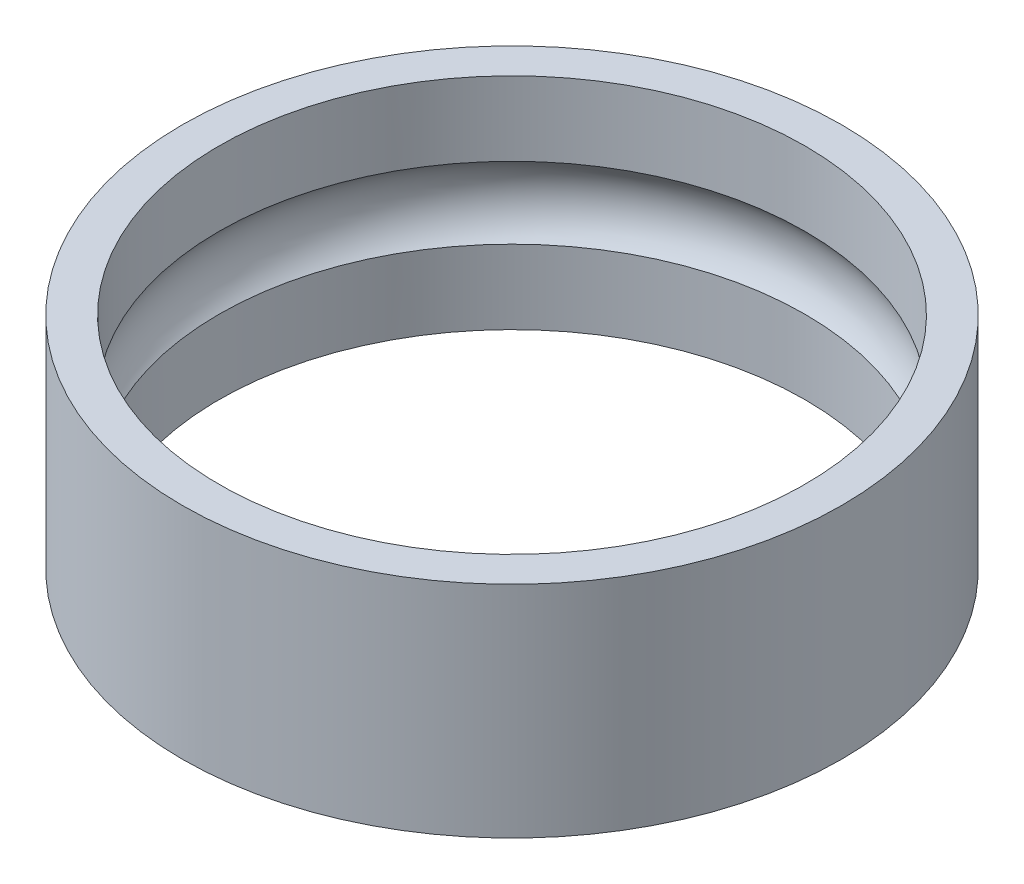
ISO-10303-21;
HEADER;
FILE_DESCRIPTION(('STEP AP214'),'2;1');
FILE_NAME('part.step','',(''),(''),'','','');
FILE_SCHEMA(('AUTOMOTIVE_DESIGN { 1 0 10303 214 1 1 1 1 }'));
ENDSEC;
DATA;
#1=APPLICATION_CONTEXT('core data for automotive mechanical design processes');
#2=APPLICATION_PROTOCOL_DEFINITION('international standard','automotive_design',2000,#1);
#3=PRODUCT_CONTEXT('',#1,'mechanical');
#4=PRODUCT('Part','Part','',(#3));
#5=PRODUCT_RELATED_PRODUCT_CATEGORY('part','',(#4));
#6=PRODUCT_DEFINITION_FORMATION('','',#4);
#7=PRODUCT_DEFINITION_CONTEXT('part definition',#1,'design');
#8=PRODUCT_DEFINITION('design','',#6,#7);
#9=PRODUCT_DEFINITION_SHAPE('','',#8);
#10=(LENGTH_UNIT() NAMED_UNIT(*) SI_UNIT(.MILLI.,.METRE.));
#11=(NAMED_UNIT(*) PLANE_ANGLE_UNIT() SI_UNIT($,.RADIAN.));
#12=(NAMED_UNIT(*) SI_UNIT($,.STERADIAN.) SOLID_ANGLE_UNIT());
#13=UNCERTAINTY_MEASURE_WITH_UNIT(LENGTH_MEASURE(1.E-05),#10,'distance_accuracy_value','');
#14=(GEOMETRIC_REPRESENTATION_CONTEXT(3) GLOBAL_UNCERTAINTY_ASSIGNED_CONTEXT((#13)) GLOBAL_UNIT_ASSIGNED_CONTEXT((#10,
#11,#12)) REPRESENTATION_CONTEXT('',''));
#15=CARTESIAN_POINT('',(0.,0.,0.));
#16=DIRECTION('',(0.,0.,1.));
#17=DIRECTION('',(1.,0.,0.));
#18=AXIS2_PLACEMENT_3D('',#15,#16,#17);
#19=CARTESIAN_POINT('',(0.,-1.5,0.));
#20=DIRECTION('',(0.,1.,0.));
#21=DIRECTION('',(1.,0.,0.));
#22=AXIS2_PLACEMENT_3D('',#19,#20,#21);
#23=PLANE('',#22);
#24=CARTESIAN_POINT('',(0.,-1.5,0.));
#25=DIRECTION('',(0.,1.,0.));
#26=DIRECTION('',(0.,0.,-1.));
#27=AXIS2_PLACEMENT_3D('',#24,#25,#26);
#28=CIRCLE('',#27,4.);
#29=CARTESIAN_POINT('',(0.,-1.5,-4.));
#30=VERTEX_POINT('',#29);
#31=EDGE_CURVE('E27',#30,#30,#28,.T.);
#32=ORIENTED_EDGE('',*,*,#31,.T.);
#33=EDGE_LOOP('',(#32));
#34=FACE_BOUND('',#33,.T.);
#35=CARTESIAN_POINT('',(0.,-1.5,0.));
#36=DIRECTION('',(0.,1.,0.));
#37=DIRECTION('',(0.,0.,1.));
#38=AXIS2_PLACEMENT_3D('',#35,#36,#37);
#39=CIRCLE('',#38,4.5);
#40=CARTESIAN_POINT('',(0.,-1.5,-4.5));
#41=VERTEX_POINT('',#40);
#42=EDGE_CURVE('E81',#41,#41,#39,.T.);
#43=ORIENTED_EDGE('',*,*,#42,.F.);
#44=EDGE_LOOP('',(#43));
#45=FACE_BOUND('',#44,.T.);
#46=ADVANCED_FACE('F16',(#34,#45),#23,.F.);
#47=CARTESIAN_POINT('',(0.,1.5,0.));
#48=DIRECTION('',(0.,1.,0.));
#49=DIRECTION('',(1.,0.,0.));
#50=AXIS2_PLACEMENT_3D('',#47,#48,#49);
#51=PLANE('',#50);
#52=CARTESIAN_POINT('',(0.,1.5,0.));
#53=DIRECTION('',(0.,1.,0.));
#54=DIRECTION('',(0.,0.,-1.));
#55=AXIS2_PLACEMENT_3D('',#52,#53,#54);
#56=CIRCLE('',#55,4.);
#57=CARTESIAN_POINT('',(0.,1.5,-4.));
#58=VERTEX_POINT('',#57);
#59=EDGE_CURVE('E11',#58,#58,#56,.T.);
#60=ORIENTED_EDGE('',*,*,#59,.F.);
#61=EDGE_LOOP('',(#60));
#62=FACE_BOUND('',#61,.T.);
#63=CARTESIAN_POINT('',(0.,1.5,0.));
#64=DIRECTION('',(0.,1.,0.));
#65=DIRECTION('',(0.,0.,1.));
#66=AXIS2_PLACEMENT_3D('',#63,#64,#65);
#67=CIRCLE('',#66,4.5);
#68=CARTESIAN_POINT('',(0.,1.5,-4.5));
#69=VERTEX_POINT('',#68);
#70=EDGE_CURVE('E20',#69,#69,#67,.T.);
#71=ORIENTED_EDGE('',*,*,#70,.T.);
#72=EDGE_LOOP('',(#71));
#73=FACE_BOUND('',#72,.T.);
#74=ADVANCED_FACE('F103',(#62,#73),#51,.T.);
#75=CARTESIAN_POINT('',(0.,1.5,0.));
#76=DIRECTION('',(0.,-1.,0.));
#77=DIRECTION('',(0.,0.,-1.));
#78=AXIS2_PLACEMENT_3D('',#75,#76,#77);
#79=CYLINDRICAL_SURFACE('',#78,4.);
#80=CARTESIAN_POINT('',(0.,0.489897948556635,0.));
#81=DIRECTION('',(0.,-1.,0.));
#82=DIRECTION('',(0.,0.,1.));
#83=AXIS2_PLACEMENT_3D('',#80,#81,#82);
#84=CIRCLE('',#83,4.);
#85=CARTESIAN_POINT('',(0.,0.489897948556634,4.));
#86=VERTEX_POINT('',#85);
#87=CARTESIAN_POINT('',(0.,0.489897948556635,-4.));
#88=VERTEX_POINT('',#87);
#89=EDGE_CURVE('E63',#86,#88,#84,.T.);
#90=ORIENTED_EDGE('',*,*,#89,.T.);
#91=CARTESIAN_POINT('',(0.,0.489897948556635,0.));
#92=DIRECTION('',(0.,-1.,0.));
#93=DIRECTION('',(0.,0.,-1.));
#94=AXIS2_PLACEMENT_3D('',#91,#92,#93);
#95=CIRCLE('',#94,4.);
#96=EDGE_CURVE('E65',#88,#86,#95,.T.);
#97=ORIENTED_EDGE('',*,*,#96,.T.);
#98=EDGE_LOOP('',(#90,#97));
#99=FACE_BOUND('',#98,.T.);
#100=ORIENTED_EDGE('',*,*,#59,.T.);
#101=EDGE_LOOP('',(#100));
#102=FACE_BOUND('',#101,.T.);
#103=ADVANCED_FACE('F18',(#99,#102),#79,.F.);
#104=CARTESIAN_POINT('',(0.,1.5,0.));
#105=DIRECTION('',(0.,-1.,0.));
#106=DIRECTION('',(0.,0.,-1.));
#107=AXIS2_PLACEMENT_3D('',#104,#105,#106);
#108=CYLINDRICAL_SURFACE('',#107,4.);
#109=CARTESIAN_POINT('',(0.,-0.489897948556635,0.));
#110=DIRECTION('',(0.,1.,0.));
#111=DIRECTION('',(0.,0.,1.));
#112=AXIS2_PLACEMENT_3D('',#109,#110,#111);
#113=CIRCLE('',#112,4.);
#114=CARTESIAN_POINT('',(0.,-0.489897948556635,4.));
#115=VERTEX_POINT('',#114);
#116=CARTESIAN_POINT('',(0.,-0.489897948556635,-4.));
#117=VERTEX_POINT('',#116);
#118=EDGE_CURVE('E79',#115,#117,#113,.T.);
#119=ORIENTED_EDGE('',*,*,#118,.T.);
#120=CARTESIAN_POINT('',(0.,-0.489897948556635,0.));
#121=DIRECTION('',(0.,1.,0.));
#122=DIRECTION('',(0.,0.,-1.));
#123=AXIS2_PLACEMENT_3D('',#120,#121,#122);
#124=CIRCLE('',#123,4.);
#125=EDGE_CURVE('E68',#117,#115,#124,.T.);
#126=ORIENTED_EDGE('',*,*,#125,.T.);
#127=EDGE_LOOP('',(#119,#126));
#128=FACE_BOUND('',#127,.T.);
#129=ORIENTED_EDGE('',*,*,#31,.F.);
#130=EDGE_LOOP('',(#129));
#131=FACE_BOUND('',#130,.T.);
#132=ADVANCED_FACE('F88',(#128,#131),#108,.F.);
#133=CARTESIAN_POINT('',(0.,1.5,0.));
#134=DIRECTION('',(0.,-1.,0.));
#135=DIRECTION('',(0.,0.,-1.));
#136=AXIS2_PLACEMENT_3D('',#133,#134,#135);
#137=CYLINDRICAL_SURFACE('',#136,4.5);
#138=ORIENTED_EDGE('',*,*,#70,.F.);
#139=EDGE_LOOP('',(#138));
#140=FACE_BOUND('',#139,.T.);
#141=ORIENTED_EDGE('',*,*,#42,.T.);
#142=EDGE_LOOP('',(#141));
#143=FACE_BOUND('',#142,.T.);
#144=ADVANCED_FACE('F92',(#140,#143),#137,.T.);
#145=CARTESIAN_POINT('',(0.,0.,0.));
#146=DIRECTION('',(0.,1.,0.));
#147=DIRECTION('',(0.,0.,1.));
#148=AXIS2_PLACEMENT_3D('',#145,#146,#147);
#149=TOROIDAL_SURFACE('',#148,3.5,0.7);
#150=ORIENTED_EDGE('',*,*,#125,.F.);
#151=ORIENTED_EDGE('',*,*,#118,.F.);
#152=EDGE_LOOP('',(#150,#151));
#153=FACE_BOUND('',#152,.T.);
#154=ORIENTED_EDGE('',*,*,#96,.F.);
#155=ORIENTED_EDGE('',*,*,#89,.F.);
#156=EDGE_LOOP('',(#154,#155));
#157=FACE_BOUND('',#156,.T.);
#158=ADVANCED_FACE('F70',(#153,#157),#149,.F.);
#159=CLOSED_SHELL('',(#46,#74,#103,#132,#144,#158));
#160=MANIFOLD_SOLID_BREP('B1',#159);
#161=ADVANCED_BREP_SHAPE_REPRESENTATION('',(#18,#160),#14);
#162=SHAPE_DEFINITION_REPRESENTATION(#9,#161);
ENDSEC;
END-ISO-10303-21;
